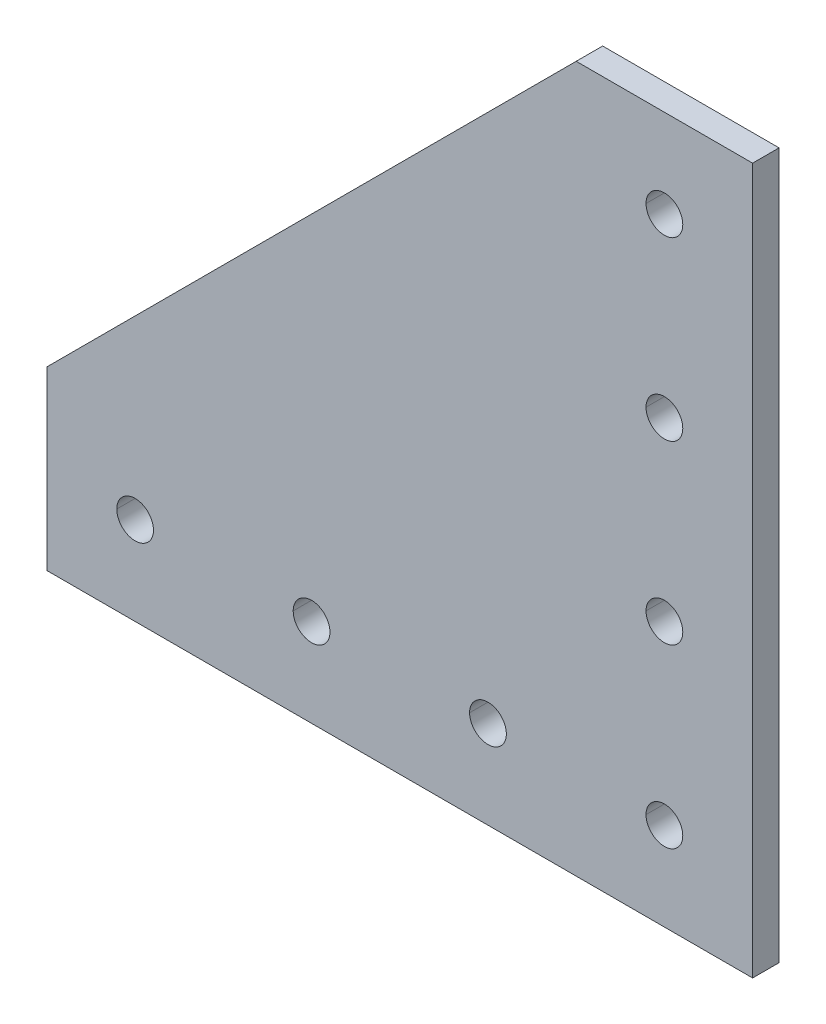
ISO-10303-21;
HEADER;
FILE_DESCRIPTION(('STEP AP214'),'2;1');
FILE_NAME('part.step','',(''),(''),'','','');
FILE_SCHEMA(('AUTOMOTIVE_DESIGN { 1 0 10303 214 1 1 1 1 }'));
ENDSEC;
DATA;
#1=APPLICATION_CONTEXT('core data for automotive mechanical design processes');
#2=APPLICATION_PROTOCOL_DEFINITION('international standard','automotive_design',2000,#1);
#3=PRODUCT_CONTEXT('',#1,'mechanical');
#4=PRODUCT('Part','Part','',(#3));
#5=PRODUCT_RELATED_PRODUCT_CATEGORY('part','',(#4));
#6=PRODUCT_DEFINITION_FORMATION('','',#4);
#7=PRODUCT_DEFINITION_CONTEXT('part definition',#1,'design');
#8=PRODUCT_DEFINITION('design','',#6,#7);
#9=PRODUCT_DEFINITION_SHAPE('','',#8);
#10=(LENGTH_UNIT() NAMED_UNIT(*) SI_UNIT(.MILLI.,.METRE.));
#11=(NAMED_UNIT(*) PLANE_ANGLE_UNIT() SI_UNIT($,.RADIAN.));
#12=(NAMED_UNIT(*) SI_UNIT($,.STERADIAN.) SOLID_ANGLE_UNIT());
#13=UNCERTAINTY_MEASURE_WITH_UNIT(LENGTH_MEASURE(1.E-05),#10,'distance_accuracy_value','');
#14=(GEOMETRIC_REPRESENTATION_CONTEXT(3) GLOBAL_UNCERTAINTY_ASSIGNED_CONTEXT((#13)) GLOBAL_UNIT_ASSIGNED_CONTEXT((#10,
#11,#12)) REPRESENTATION_CONTEXT('',''));
#15=CARTESIAN_POINT('',(0.,0.,0.));
#16=DIRECTION('',(0.,0.,1.));
#17=DIRECTION('',(1.,0.,0.));
#18=AXIS2_PLACEMENT_3D('',#15,#16,#17);
#19=CARTESIAN_POINT('',(80.,160.,6.));
#20=DIRECTION('',(0.,-1.,0.));
#21=DIRECTION('',(0.,0.,-1.));
#22=AXIS2_PLACEMENT_3D('',#19,#20,#21);
#23=PLANE('',#22);
#24=DIRECTION('',(-1.,0.,0.));
#25=VECTOR('',#24,1.);
#26=CARTESIAN_POINT('',(80.,160.,0.));
#27=LINE('',#26,#25);
#28=CARTESIAN_POINT('',(80.,160.,0.));
#29=VERTEX_POINT('',#28);
#30=CARTESIAN_POINT('',(40.,160.,0.));
#31=VERTEX_POINT('',#30);
#32=EDGE_CURVE('E11',#29,#31,#27,.T.);
#33=ORIENTED_EDGE('',*,*,#32,.T.);
#34=DIRECTION('',(0.,0.,-1.));
#35=VECTOR('',#34,1.);
#36=CARTESIAN_POINT('',(40.,160.,6.));
#37=LINE('',#36,#35);
#38=CARTESIAN_POINT('',(40.,160.,6.));
#39=VERTEX_POINT('',#38);
#40=EDGE_CURVE('E24',#39,#31,#37,.T.);
#41=ORIENTED_EDGE('',*,*,#40,.F.);
#42=DIRECTION('',(-1.,0.,0.));
#43=VECTOR('',#42,1.);
#44=CARTESIAN_POINT('',(80.,160.,6.));
#45=LINE('',#44,#43);
#46=CARTESIAN_POINT('',(80.,160.,6.));
#47=VERTEX_POINT('',#46);
#48=EDGE_CURVE('E349',#47,#39,#45,.T.);
#49=ORIENTED_EDGE('',*,*,#48,.F.);
#50=DIRECTION('',(0.,0.,-1.));
#51=VECTOR('',#50,1.);
#52=CARTESIAN_POINT('',(80.,160.,6.));
#53=LINE('',#52,#51);
#54=EDGE_CURVE('E345',#47,#29,#53,.T.);
#55=ORIENTED_EDGE('',*,*,#54,.T.);
#56=EDGE_LOOP('',(#33,#41,#49,#55));
#57=FACE_BOUND('',#56,.T.);
#58=ADVANCED_FACE('F16',(#57),#23,.F.);
#59=CARTESIAN_POINT('',(80.,0.,6.));
#60=DIRECTION('',(-1.,0.,0.));
#61=DIRECTION('',(0.,0.,1.));
#62=AXIS2_PLACEMENT_3D('',#59,#60,#61);
#63=PLANE('',#62);
#64=DIRECTION('',(0.,1.,0.));
#65=VECTOR('',#64,1.);
#66=CARTESIAN_POINT('',(80.,0.,0.));
#67=LINE('',#66,#65);
#68=CARTESIAN_POINT('',(80.,0.,0.));
#69=VERTEX_POINT('',#68);
#70=EDGE_CURVE('E340',#69,#29,#67,.T.);
#71=ORIENTED_EDGE('',*,*,#70,.T.);
#72=ORIENTED_EDGE('',*,*,#54,.F.);
#73=DIRECTION('',(0.,1.,0.));
#74=VECTOR('',#73,1.);
#75=CARTESIAN_POINT('',(80.,0.,6.));
#76=LINE('',#75,#74);
#77=CARTESIAN_POINT('',(80.,0.,6.));
#78=VERTEX_POINT('',#77);
#79=EDGE_CURVE('E335',#78,#47,#76,.T.);
#80=ORIENTED_EDGE('',*,*,#79,.F.);
#81=DIRECTION('',(0.,0.,-1.));
#82=VECTOR('',#81,1.);
#83=CARTESIAN_POINT('',(80.,0.,6.));
#84=LINE('',#83,#82);
#85=EDGE_CURVE('E331',#78,#69,#84,.T.);
#86=ORIENTED_EDGE('',*,*,#85,.T.);
#87=EDGE_LOOP('',(#71,#72,#80,#86));
#88=FACE_BOUND('',#87,.T.);
#89=ADVANCED_FACE('F373',(#88),#63,.F.);
#90=CARTESIAN_POINT('',(-80.,0.,6.));
#91=DIRECTION('',(0.,1.,0.));
#92=DIRECTION('',(0.,0.,1.));
#93=AXIS2_PLACEMENT_3D('',#90,#91,#92);
#94=PLANE('',#93);
#95=DIRECTION('',(1.,0.,0.));
#96=VECTOR('',#95,1.);
#97=CARTESIAN_POINT('',(-80.,0.,0.));
#98=LINE('',#97,#96);
#99=CARTESIAN_POINT('',(-80.,0.,0.));
#100=VERTEX_POINT('',#99);
#101=EDGE_CURVE('E326',#100,#69,#98,.T.);
#102=ORIENTED_EDGE('',*,*,#101,.T.);
#103=ORIENTED_EDGE('',*,*,#85,.F.);
#104=DIRECTION('',(1.,0.,0.));
#105=VECTOR('',#104,1.);
#106=CARTESIAN_POINT('',(-80.,0.,6.));
#107=LINE('',#106,#105);
#108=CARTESIAN_POINT('',(-80.,0.,6.));
#109=VERTEX_POINT('',#108);
#110=EDGE_CURVE('E321',#109,#78,#107,.T.);
#111=ORIENTED_EDGE('',*,*,#110,.F.);
#112=DIRECTION('',(0.,0.,-1.));
#113=VECTOR('',#112,1.);
#114=CARTESIAN_POINT('',(-80.,0.,6.));
#115=LINE('',#114,#113);
#116=EDGE_CURVE('E317',#109,#100,#115,.T.);
#117=ORIENTED_EDGE('',*,*,#116,.T.);
#118=EDGE_LOOP('',(#102,#103,#111,#117));
#119=FACE_BOUND('',#118,.T.);
#120=ADVANCED_FACE('F376',(#119),#94,.F.);
#121=CARTESIAN_POINT('',(-80.,40.,6.));
#122=DIRECTION('',(1.,0.,0.));
#123=DIRECTION('',(0.,0.,-1.));
#124=AXIS2_PLACEMENT_3D('',#121,#122,#123);
#125=PLANE('',#124);
#126=DIRECTION('',(0.,-1.,0.));
#127=VECTOR('',#126,1.);
#128=CARTESIAN_POINT('',(-80.,40.,0.));
#129=LINE('',#128,#127);
#130=CARTESIAN_POINT('',(-80.,40.,0.));
#131=VERTEX_POINT('',#130);
#132=EDGE_CURVE('E312',#131,#100,#129,.T.);
#133=ORIENTED_EDGE('',*,*,#132,.T.);
#134=ORIENTED_EDGE('',*,*,#116,.F.);
#135=DIRECTION('',(0.,-1.,0.));
#136=VECTOR('',#135,1.);
#137=CARTESIAN_POINT('',(-80.,40.,6.));
#138=LINE('',#137,#136);
#139=CARTESIAN_POINT('',(-80.,40.,6.));
#140=VERTEX_POINT('',#139);
#141=EDGE_CURVE('E307',#140,#109,#138,.T.);
#142=ORIENTED_EDGE('',*,*,#141,.F.);
#143=DIRECTION('',(0.,0.,-1.));
#144=VECTOR('',#143,1.);
#145=CARTESIAN_POINT('',(-80.,40.,6.));
#146=LINE('',#145,#144);
#147=EDGE_CURVE('E303',#140,#131,#146,.T.);
#148=ORIENTED_EDGE('',*,*,#147,.T.);
#149=EDGE_LOOP('',(#133,#134,#142,#148));
#150=FACE_BOUND('',#149,.T.);
#151=ADVANCED_FACE('F368',(#150),#125,.F.);
#152=CARTESIAN_POINT('',(40.,160.,6.));
#153=DIRECTION('',(0.707106781186548,-0.707106781186548,0.));
#154=DIRECTION('',(0.707106781186548,0.707106781186548,0.));
#155=AXIS2_PLACEMENT_3D('',#152,#153,#154);
#156=PLANE('',#155);
#157=DIRECTION('',(-0.707106781186548,-0.707106781186548,0.));
#158=VECTOR('',#157,1.);
#159=CARTESIAN_POINT('',(40.,160.,0.));
#160=LINE('',#159,#158);
#161=EDGE_CURVE('E298',#31,#131,#160,.T.);
#162=ORIENTED_EDGE('',*,*,#161,.T.);
#163=ORIENTED_EDGE('',*,*,#147,.F.);
#164=DIRECTION('',(-0.707106781186548,-0.707106781186548,0.));
#165=VECTOR('',#164,1.);
#166=CARTESIAN_POINT('',(40.,160.,6.));
#167=LINE('',#166,#165);
#168=EDGE_CURVE('E293',#39,#140,#167,.T.);
#169=ORIENTED_EDGE('',*,*,#168,.F.);
#170=ORIENTED_EDGE('',*,*,#40,.T.);
#171=EDGE_LOOP('',(#162,#163,#169,#170));
#172=FACE_BOUND('',#171,.T.);
#173=ADVANCED_FACE('F360',(#172),#156,.F.);
#174=CARTESIAN_POINT('',(0.,0.,6.));
#175=DIRECTION('',(0.,0.,1.));
#176=DIRECTION('',(1.,0.,0.));
#177=AXIS2_PLACEMENT_3D('',#174,#175,#176);
#178=PLANE('',#177);
#179=CARTESIAN_POINT('',(-60.,20.,6.));
#180=DIRECTION('',(0.,0.,1.));
#181=DIRECTION('',(1.,0.,0.));
#182=AXIS2_PLACEMENT_3D('',#179,#180,#181);
#183=CIRCLE('',#182,4.165);
#184=CARTESIAN_POINT('',(-55.835,20.,6.));
#185=VERTEX_POINT('',#184);
#186=CARTESIAN_POINT('',(-64.165,20.,6.));
#187=VERTEX_POINT('',#186);
#188=EDGE_CURVE('E288',#185,#187,#183,.T.);
#189=ORIENTED_EDGE('',*,*,#188,.F.);
#190=CARTESIAN_POINT('',(-60.,20.,6.));
#191=DIRECTION('',(0.,0.,1.));
#192=DIRECTION('',(1.,0.,0.));
#193=AXIS2_PLACEMENT_3D('',#190,#191,#192);
#194=CIRCLE('',#193,4.165);
#195=EDGE_CURVE('E283',#187,#185,#194,.T.);
#196=ORIENTED_EDGE('',*,*,#195,.F.);
#197=EDGE_LOOP('',(#189,#196));
#198=FACE_BOUND('',#197,.T.);
#199=CARTESIAN_POINT('',(-20.,20.,6.));
#200=DIRECTION('',(0.,0.,1.));
#201=DIRECTION('',(1.,0.,0.));
#202=AXIS2_PLACEMENT_3D('',#199,#200,#201);
#203=CIRCLE('',#202,4.165);
#204=CARTESIAN_POINT('',(-15.835,20.,6.));
#205=VERTEX_POINT('',#204);
#206=CARTESIAN_POINT('',(-24.165,20.,6.));
#207=VERTEX_POINT('',#206);
#208=EDGE_CURVE('E278',#205,#207,#203,.T.);
#209=ORIENTED_EDGE('',*,*,#208,.F.);
#210=CARTESIAN_POINT('',(-20.,20.,6.));
#211=DIRECTION('',(0.,0.,1.));
#212=DIRECTION('',(1.,0.,0.));
#213=AXIS2_PLACEMENT_3D('',#210,#211,#212);
#214=CIRCLE('',#213,4.165);
#215=EDGE_CURVE('E273',#207,#205,#214,.T.);
#216=ORIENTED_EDGE('',*,*,#215,.F.);
#217=EDGE_LOOP('',(#209,#216));
#218=FACE_BOUND('',#217,.T.);
#219=CARTESIAN_POINT('',(20.,20.,6.));
#220=DIRECTION('',(0.,0.,1.));
#221=DIRECTION('',(1.,0.,0.));
#222=AXIS2_PLACEMENT_3D('',#219,#220,#221);
#223=CIRCLE('',#222,4.165);
#224=CARTESIAN_POINT('',(24.165,20.,6.));
#225=VERTEX_POINT('',#224);
#226=CARTESIAN_POINT('',(15.835,20.,6.));
#227=VERTEX_POINT('',#226);
#228=EDGE_CURVE('E268',#225,#227,#223,.T.);
#229=ORIENTED_EDGE('',*,*,#228,.F.);
#230=CARTESIAN_POINT('',(20.,20.,6.));
#231=DIRECTION('',(0.,0.,1.));
#232=DIRECTION('',(1.,0.,0.));
#233=AXIS2_PLACEMENT_3D('',#230,#231,#232);
#234=CIRCLE('',#233,4.165);
#235=EDGE_CURVE('E263',#227,#225,#234,.T.);
#236=ORIENTED_EDGE('',*,*,#235,.F.);
#237=EDGE_LOOP('',(#229,#236));
#238=FACE_BOUND('',#237,.T.);
#239=CARTESIAN_POINT('',(60.,140.,6.));
#240=DIRECTION('',(0.,0.,1.));
#241=DIRECTION('',(1.,0.,0.));
#242=AXIS2_PLACEMENT_3D('',#239,#240,#241);
#243=CIRCLE('',#242,4.165);
#244=CARTESIAN_POINT('',(64.165,140.,6.));
#245=VERTEX_POINT('',#244);
#246=CARTESIAN_POINT('',(55.835,140.,6.));
#247=VERTEX_POINT('',#246);
#248=EDGE_CURVE('E258',#245,#247,#243,.T.);
#249=ORIENTED_EDGE('',*,*,#248,.F.);
#250=CARTESIAN_POINT('',(60.,140.,6.));
#251=DIRECTION('',(0.,0.,1.));
#252=DIRECTION('',(1.,0.,0.));
#253=AXIS2_PLACEMENT_3D('',#250,#251,#252);
#254=CIRCLE('',#253,4.165);
#255=EDGE_CURVE('E253',#247,#245,#254,.T.);
#256=ORIENTED_EDGE('',*,*,#255,.F.);
#257=EDGE_LOOP('',(#249,#256));
#258=FACE_BOUND('',#257,.T.);
#259=CARTESIAN_POINT('',(60.,100.,6.));
#260=DIRECTION('',(0.,0.,1.));
#261=DIRECTION('',(1.,0.,0.));
#262=AXIS2_PLACEMENT_3D('',#259,#260,#261);
#263=CIRCLE('',#262,4.165);
#264=CARTESIAN_POINT('',(64.165,100.,6.));
#265=VERTEX_POINT('',#264);
#266=CARTESIAN_POINT('',(55.835,100.,6.));
#267=VERTEX_POINT('',#266);
#268=EDGE_CURVE('E248',#265,#267,#263,.T.);
#269=ORIENTED_EDGE('',*,*,#268,.F.);
#270=CARTESIAN_POINT('',(60.,100.,6.));
#271=DIRECTION('',(0.,0.,1.));
#272=DIRECTION('',(1.,0.,0.));
#273=AXIS2_PLACEMENT_3D('',#270,#271,#272);
#274=CIRCLE('',#273,4.165);
#275=EDGE_CURVE('E243',#267,#265,#274,.T.);
#276=ORIENTED_EDGE('',*,*,#275,.F.);
#277=EDGE_LOOP('',(#269,#276));
#278=FACE_BOUND('',#277,.T.);
#279=CARTESIAN_POINT('',(60.,60.,6.));
#280=DIRECTION('',(0.,0.,1.));
#281=DIRECTION('',(1.,0.,0.));
#282=AXIS2_PLACEMENT_3D('',#279,#280,#281);
#283=CIRCLE('',#282,4.165);
#284=CARTESIAN_POINT('',(64.165,60.,6.));
#285=VERTEX_POINT('',#284);
#286=CARTESIAN_POINT('',(55.835,60.,6.));
#287=VERTEX_POINT('',#286);
#288=EDGE_CURVE('E239',#285,#287,#283,.T.);
#289=ORIENTED_EDGE('',*,*,#288,.F.);
#290=CARTESIAN_POINT('',(60.,60.,6.));
#291=DIRECTION('',(0.,0.,1.));
#292=DIRECTION('',(1.,0.,0.));
#293=AXIS2_PLACEMENT_3D('',#290,#291,#292);
#294=CIRCLE('',#293,4.165);
#295=EDGE_CURVE('E156',#287,#285,#294,.T.);
#296=ORIENTED_EDGE('',*,*,#295,.F.);
#297=EDGE_LOOP('',(#289,#296));
#298=FACE_BOUND('',#297,.T.);
#299=CARTESIAN_POINT('',(60.,20.,6.));
#300=DIRECTION('',(0.,0.,1.));
#301=DIRECTION('',(1.,0.,0.));
#302=AXIS2_PLACEMENT_3D('',#299,#300,#301);
#303=CIRCLE('',#302,4.165);
#304=CARTESIAN_POINT('',(64.165,20.,6.));
#305=VERTEX_POINT('',#304);
#306=CARTESIAN_POINT('',(55.835,20.,6.));
#307=VERTEX_POINT('',#306);
#308=EDGE_CURVE('E231',#305,#307,#303,.T.);
#309=ORIENTED_EDGE('',*,*,#308,.F.);
#310=CARTESIAN_POINT('',(60.,20.,6.));
#311=DIRECTION('',(0.,0.,1.));
#312=DIRECTION('',(1.,0.,0.));
#313=AXIS2_PLACEMENT_3D('',#310,#311,#312);
#314=CIRCLE('',#313,4.165);
#315=EDGE_CURVE('E226',#307,#305,#314,.T.);
#316=ORIENTED_EDGE('',*,*,#315,.F.);
#317=EDGE_LOOP('',(#309,#316));
#318=FACE_BOUND('',#317,.T.);
#319=ORIENTED_EDGE('',*,*,#168,.T.);
#320=ORIENTED_EDGE('',*,*,#141,.T.);
#321=ORIENTED_EDGE('',*,*,#110,.T.);
#322=ORIENTED_EDGE('',*,*,#79,.T.);
#323=ORIENTED_EDGE('',*,*,#48,.T.);
#324=EDGE_LOOP('',(#319,#320,#321,#322,#323));
#325=FACE_BOUND('',#324,.T.);
#326=ADVANCED_FACE('F370',(#198,#218,#238,#258,#278,#298,#318,#325),#178,.T.);
#327=CARTESIAN_POINT('',(60.,20.,6.));
#328=DIRECTION('',(0.,0.,1.));
#329=DIRECTION('',(0.,1.,0.));
#330=AXIS2_PLACEMENT_3D('',#327,#328,#329);
#331=CYLINDRICAL_SURFACE('',#330,4.165);
#332=CARTESIAN_POINT('',(60.,20.,0.));
#333=DIRECTION('',(0.,0.,1.));
#334=DIRECTION('',(1.,0.,0.));
#335=AXIS2_PLACEMENT_3D('',#332,#333,#334);
#336=CIRCLE('',#335,4.165);
#337=CARTESIAN_POINT('',(55.835,20.,0.));
#338=VERTEX_POINT('',#337);
#339=CARTESIAN_POINT('',(64.165,20.,0.));
#340=VERTEX_POINT('',#339);
#341=EDGE_CURVE('E221',#338,#340,#336,.T.);
#342=ORIENTED_EDGE('',*,*,#341,.F.);
#343=DIRECTION('',(0.,0.,1.));
#344=VECTOR('',#343,1.);
#345=CARTESIAN_POINT('',(55.835,20.,0.));
#346=LINE('',#345,#344);
#347=EDGE_CURVE('E216',#338,#307,#346,.T.);
#348=ORIENTED_EDGE('',*,*,#347,.T.);
#349=ORIENTED_EDGE('',*,*,#315,.T.);
#350=DIRECTION('',(0.,0.,1.));
#351=VECTOR('',#350,1.);
#352=CARTESIAN_POINT('',(64.165,20.,0.));
#353=LINE('',#352,#351);
#354=EDGE_CURVE('E211',#340,#305,#353,.T.);
#355=ORIENTED_EDGE('',*,*,#354,.F.);
#356=EDGE_LOOP('',(#342,#348,#349,#355));
#357=FACE_BOUND('',#356,.T.);
#358=ADVANCED_FACE('F424',(#357),#331,.F.);
#359=CARTESIAN_POINT('',(60.,20.,6.));
#360=DIRECTION('',(0.,0.,1.));
#361=DIRECTION('',(0.,-1.,0.));
#362=AXIS2_PLACEMENT_3D('',#359,#360,#361);
#363=CYLINDRICAL_SURFACE('',#362,4.165);
#364=ORIENTED_EDGE('',*,*,#308,.T.);
#365=ORIENTED_EDGE('',*,*,#347,.F.);
#366=CARTESIAN_POINT('',(60.,20.,0.));
#367=DIRECTION('',(0.,0.,1.));
#368=DIRECTION('',(1.,0.,0.));
#369=AXIS2_PLACEMENT_3D('',#366,#367,#368);
#370=CIRCLE('',#369,4.165);
#371=EDGE_CURVE('E206',#340,#338,#370,.T.);
#372=ORIENTED_EDGE('',*,*,#371,.F.);
#373=ORIENTED_EDGE('',*,*,#354,.T.);
#374=EDGE_LOOP('',(#364,#365,#372,#373));
#375=FACE_BOUND('',#374,.T.);
#376=ADVANCED_FACE('F434',(#375),#363,.F.);
#377=CARTESIAN_POINT('',(0.,0.,0.));
#378=DIRECTION('',(0.,0.,1.));
#379=DIRECTION('',(1.,0.,0.));
#380=AXIS2_PLACEMENT_3D('',#377,#378,#379);
#381=PLANE('',#380);
#382=CARTESIAN_POINT('',(-60.,20.,0.));
#383=DIRECTION('',(0.,0.,1.));
#384=DIRECTION('',(1.,0.,0.));
#385=AXIS2_PLACEMENT_3D('',#382,#383,#384);
#386=CIRCLE('',#385,4.165);
#387=CARTESIAN_POINT('',(-55.835,20.,0.));
#388=VERTEX_POINT('',#387);
#389=CARTESIAN_POINT('',(-64.165,20.,0.));
#390=VERTEX_POINT('',#389);
#391=EDGE_CURVE('E202',#388,#390,#386,.T.);
#392=ORIENTED_EDGE('',*,*,#391,.T.);
#393=CARTESIAN_POINT('',(-60.,20.,0.));
#394=DIRECTION('',(0.,0.,1.));
#395=DIRECTION('',(1.,0.,0.));
#396=AXIS2_PLACEMENT_3D('',#393,#394,#395);
#397=CIRCLE('',#396,4.165);
#398=EDGE_CURVE('E198',#390,#388,#397,.T.);
#399=ORIENTED_EDGE('',*,*,#398,.T.);
#400=EDGE_LOOP('',(#392,#399));
#401=FACE_BOUND('',#400,.T.);
#402=CARTESIAN_POINT('',(-20.,20.,0.));
#403=DIRECTION('',(0.,0.,1.));
#404=DIRECTION('',(1.,0.,0.));
#405=AXIS2_PLACEMENT_3D('',#402,#403,#404);
#406=CIRCLE('',#405,4.165);
#407=CARTESIAN_POINT('',(-15.835,20.,0.));
#408=VERTEX_POINT('',#407);
#409=CARTESIAN_POINT('',(-24.165,20.,0.));
#410=VERTEX_POINT('',#409);
#411=EDGE_CURVE('E194',#408,#410,#406,.T.);
#412=ORIENTED_EDGE('',*,*,#411,.T.);
#413=CARTESIAN_POINT('',(-20.,20.,0.));
#414=DIRECTION('',(0.,0.,1.));
#415=DIRECTION('',(1.,0.,0.));
#416=AXIS2_PLACEMENT_3D('',#413,#414,#415);
#417=CIRCLE('',#416,4.165);
#418=EDGE_CURVE('E190',#410,#408,#417,.T.);
#419=ORIENTED_EDGE('',*,*,#418,.T.);
#420=EDGE_LOOP('',(#412,#419));
#421=FACE_BOUND('',#420,.T.);
#422=CARTESIAN_POINT('',(20.,20.,0.));
#423=DIRECTION('',(0.,0.,1.));
#424=DIRECTION('',(1.,0.,0.));
#425=AXIS2_PLACEMENT_3D('',#422,#423,#424);
#426=CIRCLE('',#425,4.165);
#427=CARTESIAN_POINT('',(24.165,20.,0.));
#428=VERTEX_POINT('',#427);
#429=CARTESIAN_POINT('',(15.835,20.,0.));
#430=VERTEX_POINT('',#429);
#431=EDGE_CURVE('E186',#428,#430,#426,.T.);
#432=ORIENTED_EDGE('',*,*,#431,.T.);
#433=CARTESIAN_POINT('',(20.,20.,0.));
#434=DIRECTION('',(0.,0.,1.));
#435=DIRECTION('',(1.,0.,0.));
#436=AXIS2_PLACEMENT_3D('',#433,#434,#435);
#437=CIRCLE('',#436,4.165);
#438=EDGE_CURVE('E182',#430,#428,#437,.T.);
#439=ORIENTED_EDGE('',*,*,#438,.T.);
#440=EDGE_LOOP('',(#432,#439));
#441=FACE_BOUND('',#440,.T.);
#442=CARTESIAN_POINT('',(60.,140.,0.));
#443=DIRECTION('',(0.,0.,1.));
#444=DIRECTION('',(1.,0.,0.));
#445=AXIS2_PLACEMENT_3D('',#442,#443,#444);
#446=CIRCLE('',#445,4.165);
#447=CARTESIAN_POINT('',(64.165,140.,0.));
#448=VERTEX_POINT('',#447);
#449=CARTESIAN_POINT('',(55.835,140.,0.));
#450=VERTEX_POINT('',#449);
#451=EDGE_CURVE('E178',#448,#450,#446,.T.);
#452=ORIENTED_EDGE('',*,*,#451,.T.);
#453=CARTESIAN_POINT('',(60.,140.,0.));
#454=DIRECTION('',(0.,0.,1.));
#455=DIRECTION('',(1.,0.,0.));
#456=AXIS2_PLACEMENT_3D('',#453,#454,#455);
#457=CIRCLE('',#456,4.165);
#458=EDGE_CURVE('E174',#450,#448,#457,.T.);
#459=ORIENTED_EDGE('',*,*,#458,.T.);
#460=EDGE_LOOP('',(#452,#459));
#461=FACE_BOUND('',#460,.T.);
#462=CARTESIAN_POINT('',(60.,100.,0.));
#463=DIRECTION('',(0.,0.,1.));
#464=DIRECTION('',(1.,0.,0.));
#465=AXIS2_PLACEMENT_3D('',#462,#463,#464);
#466=CIRCLE('',#465,4.165);
#467=CARTESIAN_POINT('',(64.165,100.,0.));
#468=VERTEX_POINT('',#467);
#469=CARTESIAN_POINT('',(55.835,100.,0.));
#470=VERTEX_POINT('',#469);
#471=EDGE_CURVE('E164',#468,#470,#466,.T.);
#472=ORIENTED_EDGE('',*,*,#471,.T.);
#473=CARTESIAN_POINT('',(60.,100.,0.));
#474=DIRECTION('',(0.,0.,1.));
#475=DIRECTION('',(1.,0.,0.));
#476=AXIS2_PLACEMENT_3D('',#473,#474,#475);
#477=CIRCLE('',#476,4.165);
#478=EDGE_CURVE('E162',#470,#468,#477,.T.);
#479=ORIENTED_EDGE('',*,*,#478,.T.);
#480=EDGE_LOOP('',(#472,#479));
#481=FACE_BOUND('',#480,.T.);
#482=CARTESIAN_POINT('',(60.,60.,0.));
#483=DIRECTION('',(0.,0.,1.));
#484=DIRECTION('',(1.,0.,0.));
#485=AXIS2_PLACEMENT_3D('',#482,#483,#484);
#486=CIRCLE('',#485,4.165);
#487=CARTESIAN_POINT('',(64.165,60.,0.));
#488=VERTEX_POINT('',#487);
#489=CARTESIAN_POINT('',(55.835,60.,0.));
#490=VERTEX_POINT('',#489);
#491=EDGE_CURVE('E146',#488,#490,#486,.T.);
#492=ORIENTED_EDGE('',*,*,#491,.T.);
#493=CARTESIAN_POINT('',(60.,60.,0.));
#494=DIRECTION('',(0.,0.,1.));
#495=DIRECTION('',(1.,0.,0.));
#496=AXIS2_PLACEMENT_3D('',#493,#494,#495);
#497=CIRCLE('',#496,4.165);
#498=EDGE_CURVE('E141',#490,#488,#497,.T.);
#499=ORIENTED_EDGE('',*,*,#498,.T.);
#500=EDGE_LOOP('',(#492,#499));
#501=FACE_BOUND('',#500,.T.);
#502=ORIENTED_EDGE('',*,*,#371,.T.);
#503=ORIENTED_EDGE('',*,*,#341,.T.);
#504=EDGE_LOOP('',(#502,#503));
#505=FACE_BOUND('',#504,.T.);
#506=ORIENTED_EDGE('',*,*,#161,.F.);
#507=ORIENTED_EDGE('',*,*,#32,.F.);
#508=ORIENTED_EDGE('',*,*,#70,.F.);
#509=ORIENTED_EDGE('',*,*,#101,.F.);
#510=ORIENTED_EDGE('',*,*,#132,.F.);
#511=EDGE_LOOP('',(#506,#507,#508,#509,#510));
#512=FACE_BOUND('',#511,.T.);
#513=ADVANCED_FACE('F143',(#401,#421,#441,#461,#481,#501,#505,#512),#381,.F.);
#514=CARTESIAN_POINT('',(60.,60.,6.));
#515=DIRECTION('',(0.,0.,1.));
#516=DIRECTION('',(0.,1.,0.));
#517=AXIS2_PLACEMENT_3D('',#514,#515,#516);
#518=CYLINDRICAL_SURFACE('',#517,4.165);
#519=ORIENTED_EDGE('',*,*,#498,.F.);
#520=DIRECTION('',(0.,0.,1.));
#521=VECTOR('',#520,1.);
#522=CARTESIAN_POINT('',(55.835,60.,0.));
#523=LINE('',#522,#521);
#524=EDGE_CURVE('E150',#490,#287,#523,.T.);
#525=ORIENTED_EDGE('',*,*,#524,.T.);
#526=ORIENTED_EDGE('',*,*,#295,.T.);
#527=DIRECTION('',(0.,0.,1.));
#528=VECTOR('',#527,1.);
#529=CARTESIAN_POINT('',(64.165,60.,0.));
#530=LINE('',#529,#528);
#531=EDGE_CURVE('E154',#488,#285,#530,.T.);
#532=ORIENTED_EDGE('',*,*,#531,.F.);
#533=EDGE_LOOP('',(#519,#525,#526,#532));
#534=FACE_BOUND('',#533,.T.);
#535=ADVANCED_FACE('F155',(#534),#518,.F.);
#536=CARTESIAN_POINT('',(60.,60.,6.));
#537=DIRECTION('',(0.,0.,1.));
#538=DIRECTION('',(0.,-1.,0.));
#539=AXIS2_PLACEMENT_3D('',#536,#537,#538);
#540=CYLINDRICAL_SURFACE('',#539,4.165);
#541=ORIENTED_EDGE('',*,*,#288,.T.);
#542=ORIENTED_EDGE('',*,*,#524,.F.);
#543=ORIENTED_EDGE('',*,*,#491,.F.);
#544=ORIENTED_EDGE('',*,*,#531,.T.);
#545=EDGE_LOOP('',(#541,#542,#543,#544));
#546=FACE_BOUND('',#545,.T.);
#547=ADVANCED_FACE('F161',(#546),#540,.F.);
#548=CARTESIAN_POINT('',(60.,100.,6.));
#549=DIRECTION('',(0.,0.,1.));
#550=DIRECTION('',(0.,1.,0.));
#551=AXIS2_PLACEMENT_3D('',#548,#549,#550);
#552=CYLINDRICAL_SURFACE('',#551,4.165);
#553=ORIENTED_EDGE('',*,*,#478,.F.);
#554=DIRECTION('',(0.,0.,1.));
#555=VECTOR('',#554,1.);
#556=CARTESIAN_POINT('',(55.835,100.,0.));
#557=LINE('',#556,#555);
#558=EDGE_CURVE('E159',#470,#267,#557,.T.);
#559=ORIENTED_EDGE('',*,*,#558,.T.);
#560=ORIENTED_EDGE('',*,*,#275,.T.);
#561=DIRECTION('',(0.,0.,1.));
#562=VECTOR('',#561,1.);
#563=CARTESIAN_POINT('',(64.165,100.,0.));
#564=LINE('',#563,#562);
#565=EDGE_CURVE('E666',#468,#265,#564,.T.);
#566=ORIENTED_EDGE('',*,*,#565,.F.);
#567=EDGE_LOOP('',(#553,#559,#560,#566));
#568=FACE_BOUND('',#567,.T.);
#569=ADVANCED_FACE('F470',(#568),#552,.F.);
#570=CARTESIAN_POINT('',(60.,100.,6.));
#571=DIRECTION('',(0.,0.,1.));
#572=DIRECTION('',(0.,-1.,0.));
#573=AXIS2_PLACEMENT_3D('',#570,#571,#572);
#574=CYLINDRICAL_SURFACE('',#573,4.165);
#575=ORIENTED_EDGE('',*,*,#268,.T.);
#576=ORIENTED_EDGE('',*,*,#558,.F.);
#577=ORIENTED_EDGE('',*,*,#471,.F.);
#578=ORIENTED_EDGE('',*,*,#565,.T.);
#579=EDGE_LOOP('',(#575,#576,#577,#578));
#580=FACE_BOUND('',#579,.T.);
#581=ADVANCED_FACE('F479',(#580),#574,.F.);
#582=CARTESIAN_POINT('',(60.,140.,6.));
#583=DIRECTION('',(0.,0.,1.));
#584=DIRECTION('',(0.,1.,0.));
#585=AXIS2_PLACEMENT_3D('',#582,#583,#584);
#586=CYLINDRICAL_SURFACE('',#585,4.165);
#587=ORIENTED_EDGE('',*,*,#458,.F.);
#588=DIRECTION('',(0.,0.,1.));
#589=VECTOR('',#588,1.);
#590=CARTESIAN_POINT('',(55.835,140.,0.));
#591=LINE('',#590,#589);
#592=EDGE_CURVE('E661',#450,#247,#591,.T.);
#593=ORIENTED_EDGE('',*,*,#592,.T.);
#594=ORIENTED_EDGE('',*,*,#255,.T.);
#595=DIRECTION('',(0.,0.,1.));
#596=VECTOR('',#595,1.);
#597=CARTESIAN_POINT('',(64.165,140.,0.));
#598=LINE('',#597,#596);
#599=EDGE_CURVE('E656',#448,#245,#598,.T.);
#600=ORIENTED_EDGE('',*,*,#599,.F.);
#601=EDGE_LOOP('',(#587,#593,#594,#600));
#602=FACE_BOUND('',#601,.T.);
#603=ADVANCED_FACE('F489',(#602),#586,.F.);
#604=CARTESIAN_POINT('',(60.,140.,6.));
#605=DIRECTION('',(0.,0.,1.));
#606=DIRECTION('',(0.,-1.,0.));
#607=AXIS2_PLACEMENT_3D('',#604,#605,#606);
#608=CYLINDRICAL_SURFACE('',#607,4.165);
#609=ORIENTED_EDGE('',*,*,#248,.T.);
#610=ORIENTED_EDGE('',*,*,#592,.F.);
#611=ORIENTED_EDGE('',*,*,#451,.F.);
#612=ORIENTED_EDGE('',*,*,#599,.T.);
#613=EDGE_LOOP('',(#609,#610,#611,#612));
#614=FACE_BOUND('',#613,.T.);
#615=ADVANCED_FACE('F499',(#614),#608,.F.);
#616=CARTESIAN_POINT('',(20.,20.,6.));
#617=DIRECTION('',(0.,0.,1.));
#618=DIRECTION('',(0.,1.,0.));
#619=AXIS2_PLACEMENT_3D('',#616,#617,#618);
#620=CYLINDRICAL_SURFACE('',#619,4.165);
#621=ORIENTED_EDGE('',*,*,#438,.F.);
#622=DIRECTION('',(0.,0.,1.));
#623=VECTOR('',#622,1.);
#624=CARTESIAN_POINT('',(15.835,20.,0.));
#625=LINE('',#624,#623);
#626=EDGE_CURVE('E651',#430,#227,#625,.T.);
#627=ORIENTED_EDGE('',*,*,#626,.T.);
#628=ORIENTED_EDGE('',*,*,#235,.T.);
#629=DIRECTION('',(0.,0.,1.));
#630=VECTOR('',#629,1.);
#631=CARTESIAN_POINT('',(24.165,20.,0.));
#632=LINE('',#631,#630);
#633=EDGE_CURVE('E646',#428,#225,#632,.T.);
#634=ORIENTED_EDGE('',*,*,#633,.F.);
#635=EDGE_LOOP('',(#621,#627,#628,#634));
#636=FACE_BOUND('',#635,.T.);
#637=ADVANCED_FACE('F509',(#636),#620,.F.);
#638=CARTESIAN_POINT('',(20.,20.,6.));
#639=DIRECTION('',(0.,0.,1.));
#640=DIRECTION('',(0.,-1.,0.));
#641=AXIS2_PLACEMENT_3D('',#638,#639,#640);
#642=CYLINDRICAL_SURFACE('',#641,4.165);
#643=ORIENTED_EDGE('',*,*,#228,.T.);
#644=ORIENTED_EDGE('',*,*,#626,.F.);
#645=ORIENTED_EDGE('',*,*,#431,.F.);
#646=ORIENTED_EDGE('',*,*,#633,.T.);
#647=EDGE_LOOP('',(#643,#644,#645,#646));
#648=FACE_BOUND('',#647,.T.);
#649=ADVANCED_FACE('F519',(#648),#642,.F.);
#650=CARTESIAN_POINT('',(-20.,20.,6.));
#651=DIRECTION('',(0.,0.,1.));
#652=DIRECTION('',(0.,1.,0.));
#653=AXIS2_PLACEMENT_3D('',#650,#651,#652);
#654=CYLINDRICAL_SURFACE('',#653,4.165);
#655=ORIENTED_EDGE('',*,*,#418,.F.);
#656=DIRECTION('',(0.,0.,1.));
#657=VECTOR('',#656,1.);
#658=CARTESIAN_POINT('',(-24.165,20.,0.));
#659=LINE('',#658,#657);
#660=EDGE_CURVE('E634',#410,#207,#659,.T.);
#661=ORIENTED_EDGE('',*,*,#660,.T.);
#662=ORIENTED_EDGE('',*,*,#215,.T.);
#663=DIRECTION('',(0.,0.,1.));
#664=VECTOR('',#663,1.);
#665=CARTESIAN_POINT('',(-15.835,20.,0.));
#666=LINE('',#665,#664);
#667=EDGE_CURVE('E631',#408,#205,#666,.T.);
#668=ORIENTED_EDGE('',*,*,#667,.F.);
#669=EDGE_LOOP('',(#655,#661,#662,#668));
#670=FACE_BOUND('',#669,.T.);
#671=ADVANCED_FACE('F529',(#670),#654,.F.);
#672=CARTESIAN_POINT('',(-20.,20.,6.));
#673=DIRECTION('',(0.,0.,1.));
#674=DIRECTION('',(0.,-1.,0.));
#675=AXIS2_PLACEMENT_3D('',#672,#673,#674);
#676=CYLINDRICAL_SURFACE('',#675,4.165);
#677=ORIENTED_EDGE('',*,*,#208,.T.);
#678=ORIENTED_EDGE('',*,*,#660,.F.);
#679=ORIENTED_EDGE('',*,*,#411,.F.);
#680=ORIENTED_EDGE('',*,*,#667,.T.);
#681=EDGE_LOOP('',(#677,#678,#679,#680));
#682=FACE_BOUND('',#681,.T.);
#683=ADVANCED_FACE('F539',(#682),#676,.F.);
#684=CARTESIAN_POINT('',(-60.,20.,6.));
#685=DIRECTION('',(0.,0.,1.));
#686=DIRECTION('',(0.,1.,0.));
#687=AXIS2_PLACEMENT_3D('',#684,#685,#686);
#688=CYLINDRICAL_SURFACE('',#687,4.165);
#689=ORIENTED_EDGE('',*,*,#398,.F.);
#690=DIRECTION('',(0.,0.,1.));
#691=VECTOR('',#690,1.);
#692=CARTESIAN_POINT('',(-64.165,20.,0.));
#693=LINE('',#692,#691);
#694=EDGE_CURVE('E626',#390,#187,#693,.T.);
#695=ORIENTED_EDGE('',*,*,#694,.T.);
#696=ORIENTED_EDGE('',*,*,#195,.T.);
#697=DIRECTION('',(0.,0.,1.));
#698=VECTOR('',#697,1.);
#699=CARTESIAN_POINT('',(-55.835,20.,0.));
#700=LINE('',#699,#698);
#701=EDGE_CURVE('E628',#388,#185,#700,.T.);
#702=ORIENTED_EDGE('',*,*,#701,.F.);
#703=EDGE_LOOP('',(#689,#695,#696,#702));
#704=FACE_BOUND('',#703,.T.);
#705=ADVANCED_FACE('F549',(#704),#688,.F.);
#706=CARTESIAN_POINT('',(-60.,20.,6.));
#707=DIRECTION('',(0.,0.,1.));
#708=DIRECTION('',(0.,-1.,0.));
#709=AXIS2_PLACEMENT_3D('',#706,#707,#708);
#710=CYLINDRICAL_SURFACE('',#709,4.165);
#711=ORIENTED_EDGE('',*,*,#188,.T.);
#712=ORIENTED_EDGE('',*,*,#694,.F.);
#713=ORIENTED_EDGE('',*,*,#391,.F.);
#714=ORIENTED_EDGE('',*,*,#701,.T.);
#715=EDGE_LOOP('',(#711,#712,#713,#714));
#716=FACE_BOUND('',#715,.T.);
#717=ADVANCED_FACE('F559',(#716),#710,.F.);
#718=CLOSED_SHELL('',(#58,#89,#120,#151,#173,#326,#358,#376,#513,#535,#547,#569,#581,#603,#615,
#637,#649,#671,#683,#705,#717));
#719=MANIFOLD_SOLID_BREP('B1',#718);
#720=ADVANCED_BREP_SHAPE_REPRESENTATION('',(#18,#719),#14);
#721=SHAPE_DEFINITION_REPRESENTATION(#9,#720);
ENDSEC;
END-ISO-10303-21;
